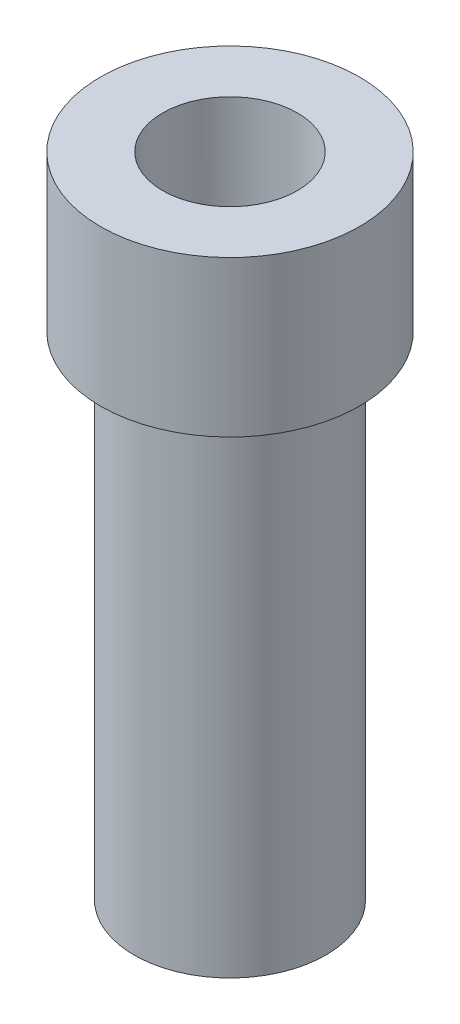
ISO-10303-21;
HEADER;
FILE_DESCRIPTION(('STEP AP214'),'2;1');
FILE_NAME('part.step','',(''),(''),'','','');
FILE_SCHEMA(('AUTOMOTIVE_DESIGN { 1 0 10303 214 1 1 1 1 }'));
ENDSEC;
DATA;
#1=APPLICATION_CONTEXT('core data for automotive mechanical design processes');
#2=APPLICATION_PROTOCOL_DEFINITION('international standard','automotive_design',2000,#1);
#3=PRODUCT_CONTEXT('',#1,'mechanical');
#4=PRODUCT('Part','Part','',(#3));
#5=PRODUCT_RELATED_PRODUCT_CATEGORY('part','',(#4));
#6=PRODUCT_DEFINITION_FORMATION('','',#4);
#7=PRODUCT_DEFINITION_CONTEXT('part definition',#1,'design');
#8=PRODUCT_DEFINITION('design','',#6,#7);
#9=PRODUCT_DEFINITION_SHAPE('','',#8);
#10=(LENGTH_UNIT() NAMED_UNIT(*) SI_UNIT(.MILLI.,.METRE.));
#11=(NAMED_UNIT(*) PLANE_ANGLE_UNIT() SI_UNIT($,.RADIAN.));
#12=(NAMED_UNIT(*) SI_UNIT($,.STERADIAN.) SOLID_ANGLE_UNIT());
#13=UNCERTAINTY_MEASURE_WITH_UNIT(LENGTH_MEASURE(1.E-05),#10,'distance_accuracy_value','');
#14=(GEOMETRIC_REPRESENTATION_CONTEXT(3) GLOBAL_UNCERTAINTY_ASSIGNED_CONTEXT((#13)) GLOBAL_UNIT_ASSIGNED_CONTEXT((#10,
#11,#12)) REPRESENTATION_CONTEXT('',''));
#15=CARTESIAN_POINT('',(0.,0.,0.));
#16=DIRECTION('',(0.,0.,1.));
#17=DIRECTION('',(1.,0.,0.));
#18=AXIS2_PLACEMENT_3D('',#15,#16,#17);
#19=CARTESIAN_POINT('',(0.,62.5,0.));
#20=DIRECTION('',(0.,-1.,0.));
#21=DIRECTION('',(0.,0.,-1.));
#22=AXIS2_PLACEMENT_3D('',#19,#20,#21);
#23=CYLINDRICAL_SURFACE('',#22,6.5);
#24=CARTESIAN_POINT('',(0.,-2.51,0.));
#25=DIRECTION('',(0.,-1.,0.));
#26=DIRECTION('',(0.,0.,-1.));
#27=AXIS2_PLACEMENT_3D('',#24,#25,#26);
#28=CIRCLE('',#27,6.5);
#29=CARTESIAN_POINT('',(0.,-2.51,-6.5));
#30=VERTEX_POINT('',#29);
#31=EDGE_CURVE('E41',#30,#30,#28,.T.);
#32=ORIENTED_EDGE('',*,*,#31,.T.);
#33=EDGE_LOOP('',(#32));
#34=FACE_BOUND('',#33,.T.);
#35=CARTESIAN_POINT('',(0.,59.99,0.));
#36=DIRECTION('',(0.,1.,0.));
#37=DIRECTION('',(0.,0.,1.));
#38=AXIS2_PLACEMENT_3D('',#35,#36,#37);
#39=CIRCLE('',#38,6.5);
#40=CARTESIAN_POINT('',(0.,59.99,6.5));
#41=VERTEX_POINT('',#40);
#42=EDGE_CURVE('E57',#41,#41,#39,.T.);
#43=ORIENTED_EDGE('',*,*,#42,.T.);
#44=EDGE_LOOP('',(#43));
#45=FACE_BOUND('',#44,.T.);
#46=ADVANCED_FACE('F34',(#34,#45),#23,.F.);
#47=CARTESIAN_POINT('',(0.,47.5,0.));
#48=DIRECTION('',(0.,1.,0.));
#49=DIRECTION('',(0.,0.,1.));
#50=AXIS2_PLACEMENT_3D('',#47,#48,#49);
#51=CYLINDRICAL_SURFACE('',#50,12.5);
#52=CARTESIAN_POINT('',(0.,44.99,0.));
#53=DIRECTION('',(0.,-1.,0.));
#54=DIRECTION('',(0.,0.,-1.));
#55=AXIS2_PLACEMENT_3D('',#52,#53,#54);
#56=CIRCLE('',#55,12.5);
#57=CARTESIAN_POINT('',(0.,44.99,-12.5));
#58=VERTEX_POINT('',#57);
#59=EDGE_CURVE('E45',#58,#58,#56,.T.);
#60=ORIENTED_EDGE('',*,*,#59,.F.);
#61=EDGE_LOOP('',(#60));
#62=FACE_BOUND('',#61,.T.);
#63=CARTESIAN_POINT('',(0.,59.99,0.));
#64=DIRECTION('',(0.,1.,0.));
#65=DIRECTION('',(0.,0.,1.));
#66=AXIS2_PLACEMENT_3D('',#63,#64,#65);
#67=CIRCLE('',#66,12.5);
#68=CARTESIAN_POINT('',(0.,59.99,12.5));
#69=VERTEX_POINT('',#68);
#70=EDGE_CURVE('E54',#69,#69,#67,.T.);
#71=ORIENTED_EDGE('',*,*,#70,.F.);
#72=EDGE_LOOP('',(#71));
#73=FACE_BOUND('',#72,.T.);
#74=ADVANCED_FACE('F69',(#62,#73),#51,.T.);
#75=CARTESIAN_POINT('',(0.,62.5,0.));
#76=DIRECTION('',(0.,-1.,0.));
#77=DIRECTION('',(0.,0.,-1.));
#78=AXIS2_PLACEMENT_3D('',#75,#76,#77);
#79=CYLINDRICAL_SURFACE('',#78,9.25);
#80=CARTESIAN_POINT('',(0.,44.99,0.));
#81=DIRECTION('',(0.,-1.,0.));
#82=DIRECTION('',(0.,0.,-1.));
#83=AXIS2_PLACEMENT_3D('',#80,#81,#82);
#84=CIRCLE('',#83,9.25);
#85=CARTESIAN_POINT('',(0.,44.99,-9.25));
#86=VERTEX_POINT('',#85);
#87=EDGE_CURVE('E49',#86,#86,#84,.T.);
#88=ORIENTED_EDGE('',*,*,#87,.T.);
#89=EDGE_LOOP('',(#88));
#90=FACE_BOUND('',#89,.T.);
#91=CARTESIAN_POINT('',(0.,-2.51,0.));
#92=DIRECTION('',(0.,-1.,0.));
#93=DIRECTION('',(0.,0.,-1.));
#94=AXIS2_PLACEMENT_3D('',#91,#92,#93);
#95=CIRCLE('',#94,9.25);
#96=CARTESIAN_POINT('',(0.,-2.51,-9.25));
#97=VERTEX_POINT('',#96);
#98=EDGE_CURVE('E10',#97,#97,#95,.T.);
#99=ORIENTED_EDGE('',*,*,#98,.F.);
#100=EDGE_LOOP('',(#99));
#101=FACE_BOUND('',#100,.T.);
#102=ADVANCED_FACE('F36',(#90,#101),#79,.T.);
#103=CARTESIAN_POINT('',(0.,-2.51,0.));
#104=DIRECTION('',(0.,-1.,0.));
#105=DIRECTION('',(0.,0.,-1.));
#106=AXIS2_PLACEMENT_3D('',#103,#104,#105);
#107=PLANE('',#106);
#108=ORIENTED_EDGE('',*,*,#98,.T.);
#109=EDGE_LOOP('',(#108));
#110=FACE_BOUND('',#109,.T.);
#111=ORIENTED_EDGE('',*,*,#31,.F.);
#112=EDGE_LOOP('',(#111));
#113=FACE_BOUND('',#112,.T.);
#114=ADVANCED_FACE('F77',(#110,#113),#107,.T.);
#115=CARTESIAN_POINT('',(0.,44.99,0.));
#116=DIRECTION('',(0.,-1.,0.));
#117=DIRECTION('',(0.,0.,-1.));
#118=AXIS2_PLACEMENT_3D('',#115,#116,#117);
#119=PLANE('',#118);
#120=ORIENTED_EDGE('',*,*,#59,.T.);
#121=EDGE_LOOP('',(#120));
#122=FACE_BOUND('',#121,.T.);
#123=ORIENTED_EDGE('',*,*,#87,.F.);
#124=EDGE_LOOP('',(#123));
#125=FACE_BOUND('',#124,.T.);
#126=ADVANCED_FACE('F65',(#122,#125),#119,.T.);
#127=CARTESIAN_POINT('',(0.,59.99,0.));
#128=DIRECTION('',(0.,1.,0.));
#129=DIRECTION('',(0.,0.,1.));
#130=AXIS2_PLACEMENT_3D('',#127,#128,#129);
#131=PLANE('',#130);
#132=ORIENTED_EDGE('',*,*,#42,.F.);
#133=EDGE_LOOP('',(#132));
#134=FACE_BOUND('',#133,.T.);
#135=ORIENTED_EDGE('',*,*,#70,.T.);
#136=EDGE_LOOP('',(#135));
#137=FACE_BOUND('',#136,.T.);
#138=ADVANCED_FACE('F62',(#134,#137),#131,.T.);
#139=CLOSED_SHELL('',(#46,#74,#102,#114,#126,#138));
#140=MANIFOLD_SOLID_BREP('B2',#139);
#141=ADVANCED_BREP_SHAPE_REPRESENTATION('',(#18,#140),#14);
#142=SHAPE_DEFINITION_REPRESENTATION(#9,#141);
ENDSEC;
END-ISO-10303-21;
